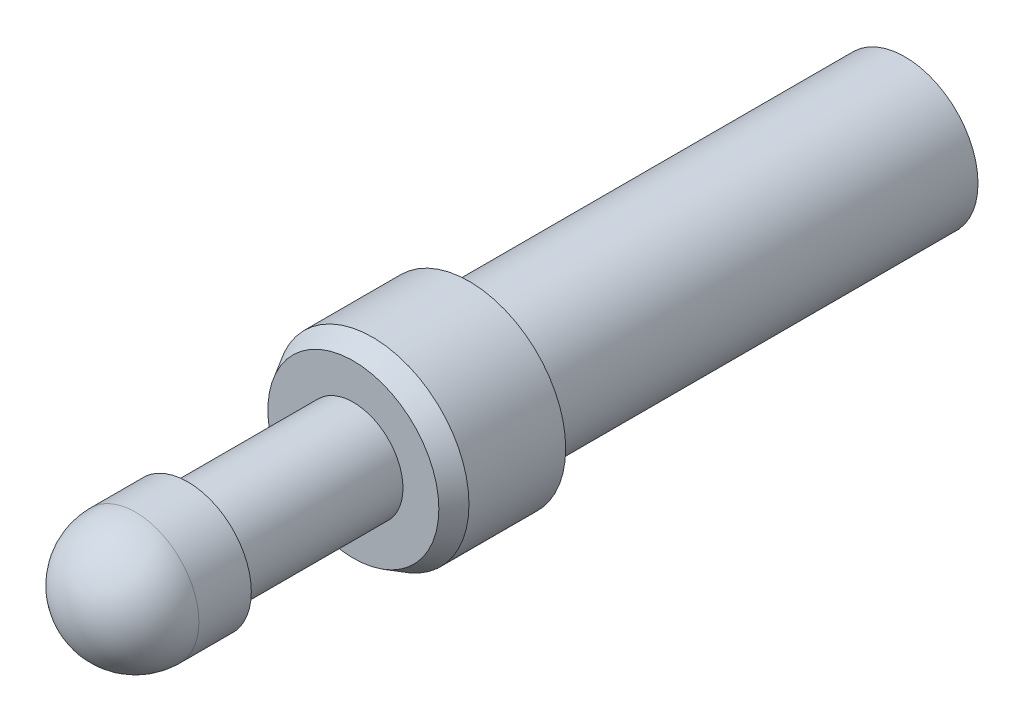
ISO-10303-21;
HEADER;
FILE_DESCRIPTION(('STEP AP214'),'2;1');
FILE_NAME('part.step','',(''),(''),'','','');
FILE_SCHEMA(('AUTOMOTIVE_DESIGN { 1 0 10303 214 1 1 1 1 }'));
ENDSEC;
DATA;
#1=APPLICATION_CONTEXT('core data for automotive mechanical design processes');
#2=APPLICATION_PROTOCOL_DEFINITION('international standard','automotive_design',2000,#1);
#3=PRODUCT_CONTEXT('',#1,'mechanical');
#4=PRODUCT('Part','Part','',(#3));
#5=PRODUCT_RELATED_PRODUCT_CATEGORY('part','',(#4));
#6=PRODUCT_DEFINITION_FORMATION('','',#4);
#7=PRODUCT_DEFINITION_CONTEXT('part definition',#1,'design');
#8=PRODUCT_DEFINITION('design','',#6,#7);
#9=PRODUCT_DEFINITION_SHAPE('','',#8);
#10=(LENGTH_UNIT() NAMED_UNIT(*) SI_UNIT(.MILLI.,.METRE.));
#11=(NAMED_UNIT(*) PLANE_ANGLE_UNIT() SI_UNIT($,.RADIAN.));
#12=(NAMED_UNIT(*) SI_UNIT($,.STERADIAN.) SOLID_ANGLE_UNIT());
#13=UNCERTAINTY_MEASURE_WITH_UNIT(LENGTH_MEASURE(1.E-05),#10,'distance_accuracy_value','');
#14=(GEOMETRIC_REPRESENTATION_CONTEXT(3) GLOBAL_UNCERTAINTY_ASSIGNED_CONTEXT((#13)) GLOBAL_UNIT_ASSIGNED_CONTEXT((#10,
#11,#12)) REPRESENTATION_CONTEXT('',''));
#15=CARTESIAN_POINT('',(0.,0.,0.));
#16=DIRECTION('',(0.,0.,1.));
#17=DIRECTION('',(1.,0.,0.));
#18=AXIS2_PLACEMENT_3D('',#15,#16,#17);
#19=CARTESIAN_POINT('',(0.,0.,10.));
#20=DIRECTION('',(0.,0.,1.));
#21=DIRECTION('',(1.,0.,0.));
#22=AXIS2_PLACEMENT_3D('',#19,#20,#21);
#23=PLANE('',#22);
#24=CARTESIAN_POINT('',(0.,0.,10.));
#25=DIRECTION('',(0.,0.,1.));
#26=DIRECTION('',(1.,0.,0.));
#27=AXIS2_PLACEMENT_3D('',#24,#25,#26);
#28=CIRCLE('',#27,1.55);
#29=CARTESIAN_POINT('',(1.55,0.,10.));
#30=VERTEX_POINT('',#29);
#31=EDGE_CURVE('E37',#30,#30,#28,.T.);
#32=ORIENTED_EDGE('',*,*,#31,.T.);
#33=EDGE_LOOP('',(#32));
#34=FACE_BOUND('',#33,.T.);
#35=CARTESIAN_POINT('',(0.,0.,10.));
#36=DIRECTION('',(0.,0.,1.));
#37=DIRECTION('',(1.,0.,0.));
#38=AXIS2_PLACEMENT_3D('',#35,#36,#37);
#39=CIRCLE('',#38,0.9);
#40=CARTESIAN_POINT('',(0.9,0.,10.));
#41=VERTEX_POINT('',#40);
#42=EDGE_CURVE('E57',#41,#41,#39,.T.);
#43=ORIENTED_EDGE('',*,*,#42,.F.);
#44=EDGE_LOOP('',(#43));
#45=FACE_BOUND('',#44,.T.);
#46=ADVANCED_FACE('F30',(#34,#45),#23,.T.);
#47=CARTESIAN_POINT('',(0.,0.,7.9));
#48=DIRECTION('',(0.,0.,-1.));
#49=DIRECTION('',(-1.,0.,0.));
#50=AXIS2_PLACEMENT_3D('',#47,#48,#49);
#51=CYLINDRICAL_SURFACE('',#50,1.325);
#52=CARTESIAN_POINT('',(0.,0.,7.9));
#53=DIRECTION('',(0.,0.,1.));
#54=DIRECTION('',(1.,0.,0.));
#55=AXIS2_PLACEMENT_3D('',#52,#53,#54);
#56=CIRCLE('',#55,1.325);
#57=CARTESIAN_POINT('',(1.325,0.,7.9));
#58=VERTEX_POINT('',#57);
#59=EDGE_CURVE('E45',#58,#58,#56,.T.);
#60=ORIENTED_EDGE('',*,*,#59,.F.);
#61=EDGE_LOOP('',(#60));
#62=FACE_BOUND('',#61,.T.);
#63=CARTESIAN_POINT('',(0.,0.,0.));
#64=DIRECTION('',(0.,0.,1.));
#65=DIRECTION('',(1.,0.,0.));
#66=AXIS2_PLACEMENT_3D('',#63,#64,#65);
#67=CIRCLE('',#66,1.325);
#68=CARTESIAN_POINT('',(1.325,0.,0.));
#69=VERTEX_POINT('',#68);
#70=EDGE_CURVE('E48',#69,#69,#67,.T.);
#71=ORIENTED_EDGE('',*,*,#70,.T.);
#72=EDGE_LOOP('',(#71));
#73=FACE_BOUND('',#72,.T.);
#74=ADVANCED_FACE('F82',(#62,#73),#51,.T.);
#75=CARTESIAN_POINT('',(0.,0.,0.));
#76=DIRECTION('',(0.,0.,1.));
#77=DIRECTION('',(1.,0.,0.));
#78=AXIS2_PLACEMENT_3D('',#75,#76,#77);
#79=PLANE('',#78);
#80=ORIENTED_EDGE('',*,*,#70,.F.);
#81=EDGE_LOOP('',(#80));
#82=FACE_BOUND('',#81,.T.);
#83=ADVANCED_FACE('F87',(#82),#79,.F.);
#84=CARTESIAN_POINT('',(0.,0.,7.9));
#85=DIRECTION('',(0.,0.,1.));
#86=DIRECTION('',(1.,0.,0.));
#87=AXIS2_PLACEMENT_3D('',#84,#85,#86);
#88=PLANE('',#87);
#89=CARTESIAN_POINT('',(0.,0.,7.9));
#90=DIRECTION('',(0.,0.,1.));
#91=DIRECTION('',(1.,0.,0.));
#92=AXIS2_PLACEMENT_3D('',#89,#90,#91);
#93=CIRCLE('',#92,1.75);
#94=CARTESIAN_POINT('',(1.75,0.,7.9));
#95=VERTEX_POINT('',#94);
#96=EDGE_CURVE('E51',#95,#95,#93,.T.);
#97=ORIENTED_EDGE('',*,*,#96,.F.);
#98=EDGE_LOOP('',(#97));
#99=FACE_BOUND('',#98,.T.);
#100=ORIENTED_EDGE('',*,*,#59,.T.);
#101=EDGE_LOOP('',(#100));
#102=FACE_BOUND('',#101,.T.);
#103=ADVANCED_FACE('F92',(#99,#102),#88,.F.);
#104=CARTESIAN_POINT('',(0.,0.,10.));
#105=DIRECTION('',(0.,0.,-1.));
#106=DIRECTION('',(-1.,0.,0.));
#107=AXIS2_PLACEMENT_3D('',#104,#105,#106);
#108=CYLINDRICAL_SURFACE('',#107,1.75);
#109=CARTESIAN_POINT('',(0.,0.,9.65358983848622));
#110=DIRECTION('',(0.,0.,1.));
#111=DIRECTION('',(1.,0.,0.));
#112=AXIS2_PLACEMENT_3D('',#109,#110,#111);
#113=CIRCLE('',#112,1.75);
#114=CARTESIAN_POINT('',(1.75,0.,9.65358983848622));
#115=VERTEX_POINT('',#114);
#116=EDGE_CURVE('E10',#115,#115,#113,.F.);
#117=ORIENTED_EDGE('',*,*,#116,.T.);
#118=EDGE_LOOP('',(#117));
#119=FACE_BOUND('',#118,.T.);
#120=ORIENTED_EDGE('',*,*,#96,.T.);
#121=EDGE_LOOP('',(#120));
#122=FACE_BOUND('',#121,.T.);
#123=ADVANCED_FACE('F77',(#119,#122),#108,.T.);
#124=CARTESIAN_POINT('',(0.,0.,13.));
#125=DIRECTION('',(0.,0.,-1.));
#126=DIRECTION('',(-1.,0.,0.));
#127=AXIS2_PLACEMENT_3D('',#124,#125,#126);
#128=CYLINDRICAL_SURFACE('',#127,0.9);
#129=CARTESIAN_POINT('',(0.,0.,13.));
#130=DIRECTION('',(0.,0.,1.));
#131=DIRECTION('',(1.,0.,0.));
#132=AXIS2_PLACEMENT_3D('',#129,#130,#131);
#133=CIRCLE('',#132,0.9);
#134=CARTESIAN_POINT('',(0.9,0.,13.));
#135=VERTEX_POINT('',#134);
#136=EDGE_CURVE('E56',#135,#135,#133,.T.);
#137=ORIENTED_EDGE('',*,*,#136,.F.);
#138=EDGE_LOOP('',(#137));
#139=FACE_BOUND('',#138,.T.);
#140=ORIENTED_EDGE('',*,*,#42,.T.);
#141=EDGE_LOOP('',(#140));
#142=FACE_BOUND('',#141,.T.);
#143=ADVANCED_FACE('F71',(#139,#142),#128,.T.);
#144=CARTESIAN_POINT('',(0.,0.,13.));
#145=DIRECTION('',(0.,0.,1.));
#146=DIRECTION('',(1.,0.,0.));
#147=AXIS2_PLACEMENT_3D('',#144,#145,#146);
#148=PLANE('',#147);
#149=CARTESIAN_POINT('',(0.,0.,13.));
#150=DIRECTION('',(0.,0.,1.));
#151=DIRECTION('',(1.,0.,0.));
#152=AXIS2_PLACEMENT_3D('',#149,#150,#151);
#153=CIRCLE('',#152,1.15);
#154=CARTESIAN_POINT('',(1.15,0.,13.));
#155=VERTEX_POINT('',#154);
#156=EDGE_CURVE('E60',#155,#155,#153,.T.);
#157=ORIENTED_EDGE('',*,*,#156,.F.);
#158=EDGE_LOOP('',(#157));
#159=FACE_BOUND('',#158,.T.);
#160=ORIENTED_EDGE('',*,*,#136,.T.);
#161=EDGE_LOOP('',(#160));
#162=FACE_BOUND('',#161,.T.);
#163=ADVANCED_FACE('F68',(#159,#162),#148,.F.);
#164=CARTESIAN_POINT('',(0.,0.,15.1));
#165=DIRECTION('',(0.,0.,-1.));
#166=DIRECTION('',(-1.,0.,0.));
#167=AXIS2_PLACEMENT_3D('',#164,#165,#166);
#168=CYLINDRICAL_SURFACE('',#167,1.15);
#169=CARTESIAN_POINT('',(0.,0.,13.95));
#170=DIRECTION('',(0.,0.,-1.));
#171=DIRECTION('',(-1.,0.,0.));
#172=AXIS2_PLACEMENT_3D('',#169,#170,#171);
#173=CIRCLE('',#172,1.15);
#174=CARTESIAN_POINT('',(-1.15,0.,13.95));
#175=VERTEX_POINT('',#174);
#176=EDGE_CURVE('E41',#175,#175,#173,.T.);
#177=ORIENTED_EDGE('',*,*,#176,.T.);
#178=EDGE_LOOP('',(#177));
#179=FACE_BOUND('',#178,.T.);
#180=ORIENTED_EDGE('',*,*,#156,.T.);
#181=EDGE_LOOP('',(#180));
#182=FACE_BOUND('',#181,.T.);
#183=ADVANCED_FACE('F66',(#179,#182),#168,.T.);
#184=CARTESIAN_POINT('',(0.,0.,13.95));
#185=DIRECTION('',(0.,0.,1.));
#186=DIRECTION('',(1.,0.,0.));
#187=AXIS2_PLACEMENT_3D('',#184,#185,#186);
#188=SPHERICAL_SURFACE('',#187,1.15);
#189=ORIENTED_EDGE('',*,*,#176,.F.);
#190=EDGE_LOOP('',(#189));
#191=FACE_BOUND('',#190,.T.);
#192=ADVANCED_FACE('F100',(#191),#188,.T.);
#193=CARTESIAN_POINT('',(0.,0.,10.));
#194=DIRECTION('',(0.,0.,-1.));
#195=DIRECTION('',(-1.,0.,0.));
#196=AXIS2_PLACEMENT_3D('',#193,#194,#195);
#197=CONICAL_SURFACE('',#196,1.55,0.523598775598298);
#198=ORIENTED_EDGE('',*,*,#116,.F.);
#199=EDGE_LOOP('',(#198));
#200=FACE_BOUND('',#199,.T.);
#201=ORIENTED_EDGE('',*,*,#31,.F.);
#202=EDGE_LOOP('',(#201));
#203=FACE_BOUND('',#202,.T.);
#204=ADVANCED_FACE('F32',(#200,#203),#197,.T.);
#205=CLOSED_SHELL('',(#46,#74,#83,#103,#123,#143,#163,#183,#192,#204));
#206=MANIFOLD_SOLID_BREP('B2',#205);
#207=ADVANCED_BREP_SHAPE_REPRESENTATION('',(#18,#206),#14);
#208=SHAPE_DEFINITION_REPRESENTATION(#9,#207);
ENDSEC;
END-ISO-10303-21;
